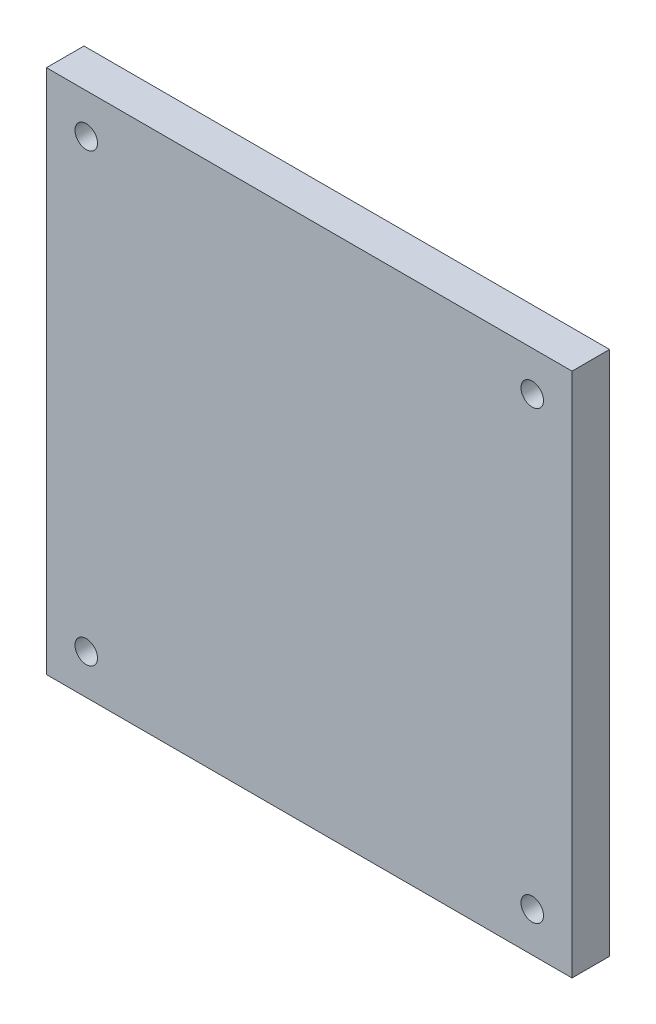
ISO-10303-21;
HEADER;
FILE_DESCRIPTION(('STEP AP214'),'2;1');
FILE_NAME('part.step','',(''),(''),'','','');
FILE_SCHEMA(('AUTOMOTIVE_DESIGN { 1 0 10303 214 1 1 1 1 }'));
ENDSEC;
DATA;
#1=APPLICATION_CONTEXT('core data for automotive mechanical design processes');
#2=APPLICATION_PROTOCOL_DEFINITION('international standard','automotive_design',2000,#1);
#3=PRODUCT_CONTEXT('',#1,'mechanical');
#4=PRODUCT('Part','Part','',(#3));
#5=PRODUCT_RELATED_PRODUCT_CATEGORY('part','',(#4));
#6=PRODUCT_DEFINITION_FORMATION('','',#4);
#7=PRODUCT_DEFINITION_CONTEXT('part definition',#1,'design');
#8=PRODUCT_DEFINITION('design','',#6,#7);
#9=PRODUCT_DEFINITION_SHAPE('','',#8);
#10=(LENGTH_UNIT() NAMED_UNIT(*) SI_UNIT(.MILLI.,.METRE.));
#11=(NAMED_UNIT(*) PLANE_ANGLE_UNIT() SI_UNIT($,.RADIAN.));
#12=(NAMED_UNIT(*) SI_UNIT($,.STERADIAN.) SOLID_ANGLE_UNIT());
#13=UNCERTAINTY_MEASURE_WITH_UNIT(LENGTH_MEASURE(1.E-05),#10,'distance_accuracy_value','');
#14=(GEOMETRIC_REPRESENTATION_CONTEXT(3) GLOBAL_UNCERTAINTY_ASSIGNED_CONTEXT((#13)) GLOBAL_UNIT_ASSIGNED_CONTEXT((#10,
#11,#12)) REPRESENTATION_CONTEXT('',''));
#15=CARTESIAN_POINT('',(0.,0.,0.));
#16=DIRECTION('',(0.,0.,1.));
#17=DIRECTION('',(1.,0.,0.));
#18=AXIS2_PLACEMENT_3D('',#15,#16,#17);
#19=CARTESIAN_POINT('',(35.,-35.,5.));
#20=DIRECTION('',(-1.,0.,0.));
#21=DIRECTION('',(0.,0.,1.));
#22=AXIS2_PLACEMENT_3D('',#19,#20,#21);
#23=PLANE('',#22);
#24=DIRECTION('',(0.,1.,0.));
#25=VECTOR('',#24,1.);
#26=CARTESIAN_POINT('',(35.,-35.,0.));
#27=LINE('',#26,#25);
#28=CARTESIAN_POINT('',(35.,-35.,0.));
#29=VERTEX_POINT('',#28);
#30=CARTESIAN_POINT('',(35.,35.,0.));
#31=VERTEX_POINT('',#30);
#32=EDGE_CURVE('E119',#29,#31,#27,.T.);
#33=ORIENTED_EDGE('',*,*,#32,.T.);
#34=DIRECTION('',(0.,0.,-1.));
#35=VECTOR('',#34,1.);
#36=CARTESIAN_POINT('',(35.,35.,5.));
#37=LINE('',#36,#35);
#38=CARTESIAN_POINT('',(35.,35.,5.));
#39=VERTEX_POINT('',#38);
#40=EDGE_CURVE('E11',#39,#31,#37,.T.);
#41=ORIENTED_EDGE('',*,*,#40,.F.);
#42=DIRECTION('',(0.,1.,0.));
#43=VECTOR('',#42,1.);
#44=CARTESIAN_POINT('',(35.,-35.,5.));
#45=LINE('',#44,#43);
#46=CARTESIAN_POINT('',(35.,-35.,5.));
#47=VERTEX_POINT('',#46);
#48=EDGE_CURVE('E103',#47,#39,#45,.T.);
#49=ORIENTED_EDGE('',*,*,#48,.F.);
#50=DIRECTION('',(0.,0.,-1.));
#51=VECTOR('',#50,1.);
#52=CARTESIAN_POINT('',(35.,-35.,5.));
#53=LINE('',#52,#51);
#54=EDGE_CURVE('E115',#47,#29,#53,.T.);
#55=ORIENTED_EDGE('',*,*,#54,.T.);
#56=EDGE_LOOP('',(#33,#41,#49,#55));
#57=FACE_BOUND('',#56,.T.);
#58=ADVANCED_FACE('F51',(#57),#23,.F.);
#59=CARTESIAN_POINT('',(-35.,35.,5.));
#60=DIRECTION('',(0.,-1.,0.));
#61=DIRECTION('',(0.,0.,-1.));
#62=AXIS2_PLACEMENT_3D('',#59,#60,#61);
#63=PLANE('',#62);
#64=DIRECTION('',(-1.,0.,0.));
#65=VECTOR('',#64,1.);
#66=CARTESIAN_POINT('',(-35.,35.,0.));
#67=LINE('',#66,#65);
#68=CARTESIAN_POINT('',(-35.,35.,0.));
#69=VERTEX_POINT('',#68);
#70=EDGE_CURVE('E108',#31,#69,#67,.T.);
#71=ORIENTED_EDGE('',*,*,#70,.T.);
#72=DIRECTION('',(0.,0.,-1.));
#73=VECTOR('',#72,1.);
#74=CARTESIAN_POINT('',(-35.,35.,5.));
#75=LINE('',#74,#73);
#76=CARTESIAN_POINT('',(-35.,35.,5.));
#77=VERTEX_POINT('',#76);
#78=EDGE_CURVE('E60',#77,#69,#75,.T.);
#79=ORIENTED_EDGE('',*,*,#78,.F.);
#80=DIRECTION('',(-1.,0.,0.));
#81=VECTOR('',#80,1.);
#82=CARTESIAN_POINT('',(-35.,35.,5.));
#83=LINE('',#82,#81);
#84=EDGE_CURVE('E98',#39,#77,#83,.T.);
#85=ORIENTED_EDGE('',*,*,#84,.F.);
#86=ORIENTED_EDGE('',*,*,#40,.T.);
#87=EDGE_LOOP('',(#71,#79,#85,#86));
#88=FACE_BOUND('',#87,.T.);
#89=ADVANCED_FACE('F107',(#88),#63,.F.);
#90=CARTESIAN_POINT('',(-35.,-35.,5.));
#91=DIRECTION('',(1.,0.,0.));
#92=DIRECTION('',(0.,0.,-1.));
#93=AXIS2_PLACEMENT_3D('',#90,#91,#92);
#94=PLANE('',#93);
#95=DIRECTION('',(0.,-1.,0.));
#96=VECTOR('',#95,1.);
#97=CARTESIAN_POINT('',(-35.,-35.,0.));
#98=LINE('',#97,#96);
#99=CARTESIAN_POINT('',(-35.,-35.,0.));
#100=VERTEX_POINT('',#99);
#101=EDGE_CURVE('E85',#69,#100,#98,.T.);
#102=ORIENTED_EDGE('',*,*,#101,.T.);
#103=DIRECTION('',(0.,0.,-1.));
#104=VECTOR('',#103,1.);
#105=CARTESIAN_POINT('',(-35.,-35.,5.));
#106=LINE('',#105,#104);
#107=CARTESIAN_POINT('',(-35.,-35.,5.));
#108=VERTEX_POINT('',#107);
#109=EDGE_CURVE('E110',#108,#100,#106,.T.);
#110=ORIENTED_EDGE('',*,*,#109,.F.);
#111=DIRECTION('',(0.,-1.,0.));
#112=VECTOR('',#111,1.);
#113=CARTESIAN_POINT('',(-35.,-35.,5.));
#114=LINE('',#113,#112);
#115=EDGE_CURVE('E101',#77,#108,#114,.T.);
#116=ORIENTED_EDGE('',*,*,#115,.F.);
#117=ORIENTED_EDGE('',*,*,#78,.T.);
#118=EDGE_LOOP('',(#102,#110,#116,#117));
#119=FACE_BOUND('',#118,.T.);
#120=ADVANCED_FACE('F111',(#119),#94,.F.);
#121=CARTESIAN_POINT('',(-35.,-35.,5.));
#122=DIRECTION('',(0.,1.,0.));
#123=DIRECTION('',(0.,0.,1.));
#124=AXIS2_PLACEMENT_3D('',#121,#122,#123);
#125=PLANE('',#124);
#126=DIRECTION('',(1.,0.,0.));
#127=VECTOR('',#126,1.);
#128=CARTESIAN_POINT('',(-35.,-35.,0.));
#129=LINE('',#128,#127);
#130=EDGE_CURVE('E91',#100,#29,#129,.T.);
#131=ORIENTED_EDGE('',*,*,#130,.T.);
#132=ORIENTED_EDGE('',*,*,#54,.F.);
#133=DIRECTION('',(1.,0.,0.));
#134=VECTOR('',#133,1.);
#135=CARTESIAN_POINT('',(-35.,-35.,5.));
#136=LINE('',#135,#134);
#137=EDGE_CURVE('E68',#108,#47,#136,.T.);
#138=ORIENTED_EDGE('',*,*,#137,.F.);
#139=ORIENTED_EDGE('',*,*,#109,.T.);
#140=EDGE_LOOP('',(#131,#132,#138,#139));
#141=FACE_BOUND('',#140,.T.);
#142=ADVANCED_FACE('F133',(#141),#125,.F.);
#143=CARTESIAN_POINT('',(0.,0.,5.));
#144=DIRECTION('',(0.,0.,-1.));
#145=DIRECTION('',(-1.,0.,0.));
#146=AXIS2_PLACEMENT_3D('',#143,#144,#145);
#147=PLANE('',#146);
#148=CARTESIAN_POINT('',(-29.7000000000003,-29.6999999999997,5.));
#149=DIRECTION('',(0.,0.,1.));
#150=DIRECTION('',(1.,0.,0.));
#151=AXIS2_PLACEMENT_3D('',#148,#149,#150);
#152=CIRCLE('',#151,1.5);
#153=CARTESIAN_POINT('',(-28.2000000000003,-29.6999999999997,5.));
#154=VERTEX_POINT('',#153);
#155=EDGE_CURVE('E152',#154,#154,#152,.T.);
#156=ORIENTED_EDGE('',*,*,#155,.F.);
#157=EDGE_LOOP('',(#156));
#158=FACE_BOUND('',#157,.T.);
#159=CARTESIAN_POINT('',(29.6999999999998,-29.7000000000002,5.));
#160=DIRECTION('',(0.,0.,1.));
#161=DIRECTION('',(1.,0.,0.));
#162=AXIS2_PLACEMENT_3D('',#159,#160,#161);
#163=CIRCLE('',#162,1.5);
#164=CARTESIAN_POINT('',(31.1999999999998,-29.7000000000002,5.));
#165=VERTEX_POINT('',#164);
#166=EDGE_CURVE('E160',#165,#165,#163,.T.);
#167=ORIENTED_EDGE('',*,*,#166,.F.);
#168=EDGE_LOOP('',(#167));
#169=FACE_BOUND('',#168,.T.);
#170=CARTESIAN_POINT('',(29.7000000000001,29.6999999999999,5.));
#171=DIRECTION('',(0.,0.,1.));
#172=DIRECTION('',(1.,0.,0.));
#173=AXIS2_PLACEMENT_3D('',#170,#171,#172);
#174=CIRCLE('',#173,1.5);
#175=CARTESIAN_POINT('',(31.2000000000001,29.6999999999999,5.));
#176=VERTEX_POINT('',#175);
#177=EDGE_CURVE('E144',#176,#176,#174,.T.);
#178=ORIENTED_EDGE('',*,*,#177,.F.);
#179=EDGE_LOOP('',(#178));
#180=FACE_BOUND('',#179,.T.);
#181=CARTESIAN_POINT('',(-29.7,29.7,5.));
#182=DIRECTION('',(0.,0.,1.));
#183=DIRECTION('',(1.,0.,0.));
#184=AXIS2_PLACEMENT_3D('',#181,#182,#183);
#185=CIRCLE('',#184,1.5);
#186=CARTESIAN_POINT('',(-28.2,29.7,5.));
#187=VERTEX_POINT('',#186);
#188=EDGE_CURVE('E140',#187,#187,#185,.T.);
#189=ORIENTED_EDGE('',*,*,#188,.F.);
#190=EDGE_LOOP('',(#189));
#191=FACE_BOUND('',#190,.T.);
#192=ORIENTED_EDGE('',*,*,#48,.T.);
#193=ORIENTED_EDGE('',*,*,#84,.T.);
#194=ORIENTED_EDGE('',*,*,#115,.T.);
#195=ORIENTED_EDGE('',*,*,#137,.T.);
#196=EDGE_LOOP('',(#192,#193,#194,#195));
#197=FACE_BOUND('',#196,.T.);
#198=ADVANCED_FACE('F99',(#158,#169,#180,#191,#197),#147,.F.);
#199=CARTESIAN_POINT('',(0.,0.,0.));
#200=DIRECTION('',(0.,0.,-1.));
#201=DIRECTION('',(-1.,0.,0.));
#202=AXIS2_PLACEMENT_3D('',#199,#200,#201);
#203=PLANE('',#202);
#204=CARTESIAN_POINT('',(-29.7000000000003,-29.6999999999997,0.));
#205=DIRECTION('',(0.,0.,1.));
#206=DIRECTION('',(1.,0.,0.));
#207=AXIS2_PLACEMENT_3D('',#204,#205,#206);
#208=CIRCLE('',#207,1.5);
#209=CARTESIAN_POINT('',(-28.2000000000003,-29.6999999999997,0.));
#210=VERTEX_POINT('',#209);
#211=EDGE_CURVE('E148',#210,#210,#208,.T.);
#212=ORIENTED_EDGE('',*,*,#211,.T.);
#213=EDGE_LOOP('',(#212));
#214=FACE_BOUND('',#213,.T.);
#215=CARTESIAN_POINT('',(29.6999999999998,-29.7000000000002,0.));
#216=DIRECTION('',(0.,0.,1.));
#217=DIRECTION('',(1.,0.,0.));
#218=AXIS2_PLACEMENT_3D('',#215,#216,#217);
#219=CIRCLE('',#218,1.5);
#220=CARTESIAN_POINT('',(31.1999999999998,-29.7000000000002,0.));
#221=VERTEX_POINT('',#220);
#222=EDGE_CURVE('E156',#221,#221,#219,.T.);
#223=ORIENTED_EDGE('',*,*,#222,.T.);
#224=EDGE_LOOP('',(#223));
#225=FACE_BOUND('',#224,.T.);
#226=CARTESIAN_POINT('',(29.7000000000001,29.6999999999999,0.));
#227=DIRECTION('',(0.,0.,1.));
#228=DIRECTION('',(1.,0.,0.));
#229=AXIS2_PLACEMENT_3D('',#226,#227,#228);
#230=CIRCLE('',#229,1.5);
#231=CARTESIAN_POINT('',(31.2000000000001,29.6999999999999,0.));
#232=VERTEX_POINT('',#231);
#233=EDGE_CURVE('E164',#232,#232,#230,.T.);
#234=ORIENTED_EDGE('',*,*,#233,.T.);
#235=EDGE_LOOP('',(#234));
#236=FACE_BOUND('',#235,.T.);
#237=CARTESIAN_POINT('',(-29.7,29.7,0.));
#238=DIRECTION('',(0.,0.,1.));
#239=DIRECTION('',(1.,0.,0.));
#240=AXIS2_PLACEMENT_3D('',#237,#238,#239);
#241=CIRCLE('',#240,1.5);
#242=CARTESIAN_POINT('',(-28.2,29.7,0.));
#243=VERTEX_POINT('',#242);
#244=EDGE_CURVE('E123',#243,#243,#241,.T.);
#245=ORIENTED_EDGE('',*,*,#244,.T.);
#246=EDGE_LOOP('',(#245));
#247=FACE_BOUND('',#246,.T.);
#248=ORIENTED_EDGE('',*,*,#32,.F.);
#249=ORIENTED_EDGE('',*,*,#130,.F.);
#250=ORIENTED_EDGE('',*,*,#101,.F.);
#251=ORIENTED_EDGE('',*,*,#70,.F.);
#252=EDGE_LOOP('',(#248,#249,#250,#251));
#253=FACE_BOUND('',#252,.T.);
#254=ADVANCED_FACE('F136',(#214,#225,#236,#247,#253),#203,.T.);
#255=CARTESIAN_POINT('',(-29.7,29.7,0.));
#256=DIRECTION('',(0.,0.,1.));
#257=DIRECTION('',(1.,0.,0.));
#258=AXIS2_PLACEMENT_3D('',#255,#256,#257);
#259=CYLINDRICAL_SURFACE('',#258,1.5);
#260=ORIENTED_EDGE('',*,*,#244,.F.);
#261=EDGE_LOOP('',(#260));
#262=FACE_BOUND('',#261,.T.);
#263=ORIENTED_EDGE('',*,*,#188,.T.);
#264=EDGE_LOOP('',(#263));
#265=FACE_BOUND('',#264,.T.);
#266=ADVANCED_FACE('F180',(#262,#265),#259,.F.);
#267=CARTESIAN_POINT('',(29.7000000000001,29.6999999999999,0.));
#268=DIRECTION('',(0.,0.,1.));
#269=DIRECTION('',(1.,0.,0.));
#270=AXIS2_PLACEMENT_3D('',#267,#268,#269);
#271=CYLINDRICAL_SURFACE('',#270,1.5);
#272=ORIENTED_EDGE('',*,*,#233,.F.);
#273=EDGE_LOOP('',(#272));
#274=FACE_BOUND('',#273,.T.);
#275=ORIENTED_EDGE('',*,*,#177,.T.);
#276=EDGE_LOOP('',(#275));
#277=FACE_BOUND('',#276,.T.);
#278=ADVANCED_FACE('F172',(#274,#277),#271,.F.);
#279=CARTESIAN_POINT('',(29.6999999999998,-29.7000000000002,0.));
#280=DIRECTION('',(0.,0.,1.));
#281=DIRECTION('',(1.,0.,0.));
#282=AXIS2_PLACEMENT_3D('',#279,#280,#281);
#283=CYLINDRICAL_SURFACE('',#282,1.5);
#284=ORIENTED_EDGE('',*,*,#222,.F.);
#285=EDGE_LOOP('',(#284));
#286=FACE_BOUND('',#285,.T.);
#287=ORIENTED_EDGE('',*,*,#166,.T.);
#288=EDGE_LOOP('',(#287));
#289=FACE_BOUND('',#288,.T.);
#290=ADVANCED_FACE('F187',(#286,#289),#283,.F.);
#291=CARTESIAN_POINT('',(-29.7000000000003,-29.6999999999997,0.));
#292=DIRECTION('',(0.,0.,1.));
#293=DIRECTION('',(1.,0.,0.));
#294=AXIS2_PLACEMENT_3D('',#291,#292,#293);
#295=CYLINDRICAL_SURFACE('',#294,1.5);
#296=ORIENTED_EDGE('',*,*,#211,.F.);
#297=EDGE_LOOP('',(#296));
#298=FACE_BOUND('',#297,.T.);
#299=ORIENTED_EDGE('',*,*,#155,.T.);
#300=EDGE_LOOP('',(#299));
#301=FACE_BOUND('',#300,.T.);
#302=ADVANCED_FACE('F247',(#298,#301),#295,.F.);
#303=CLOSED_SHELL('',(#58,#89,#120,#142,#198,#254,#266,#278,#290,#302));
#304=MANIFOLD_SOLID_BREP('B2',#303);
#305=ADVANCED_BREP_SHAPE_REPRESENTATION('',(#18,#304),#14);
#306=SHAPE_DEFINITION_REPRESENTATION(#9,#305);
ENDSEC;
END-ISO-10303-21;
